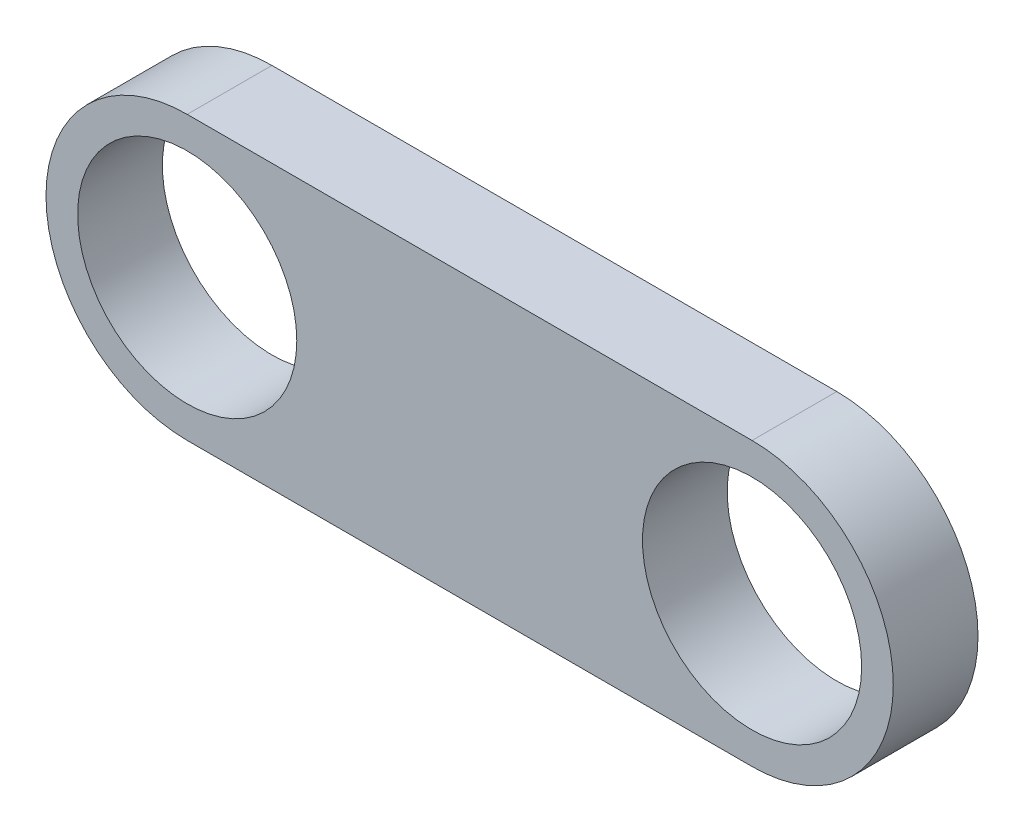
ISO-10303-21;
HEADER;
FILE_DESCRIPTION(('STEP AP214'),'2;1');
FILE_NAME('part.step','',(''),(''),'','','');
FILE_SCHEMA(('AUTOMOTIVE_DESIGN { 1 0 10303 214 1 1 1 1 }'));
ENDSEC;
DATA;
#1=APPLICATION_CONTEXT('core data for automotive mechanical design processes');
#2=APPLICATION_PROTOCOL_DEFINITION('international standard','automotive_design',2000,#1);
#3=PRODUCT_CONTEXT('',#1,'mechanical');
#4=PRODUCT('Part','Part','',(#3));
#5=PRODUCT_RELATED_PRODUCT_CATEGORY('part','',(#4));
#6=PRODUCT_DEFINITION_FORMATION('','',#4);
#7=PRODUCT_DEFINITION_CONTEXT('part definition',#1,'design');
#8=PRODUCT_DEFINITION('design','',#6,#7);
#9=PRODUCT_DEFINITION_SHAPE('','',#8);
#10=(LENGTH_UNIT() NAMED_UNIT(*) SI_UNIT(.MILLI.,.METRE.));
#11=(NAMED_UNIT(*) PLANE_ANGLE_UNIT() SI_UNIT($,.RADIAN.));
#12=(NAMED_UNIT(*) SI_UNIT($,.STERADIAN.) SOLID_ANGLE_UNIT());
#13=UNCERTAINTY_MEASURE_WITH_UNIT(LENGTH_MEASURE(1.E-05),#10,'distance_accuracy_value','');
#14=(GEOMETRIC_REPRESENTATION_CONTEXT(3) GLOBAL_UNCERTAINTY_ASSIGNED_CONTEXT((#13)) GLOBAL_UNIT_ASSIGNED_CONTEXT((#10,
#11,#12)) REPRESENTATION_CONTEXT('',''));
#15=CARTESIAN_POINT('',(0.,0.,0.));
#16=DIRECTION('',(0.,0.,1.));
#17=DIRECTION('',(1.,0.,0.));
#18=AXIS2_PLACEMENT_3D('',#15,#16,#17);
#19=CARTESIAN_POINT('',(-12.2019654064157,0.105370501409911,3.));
#20=DIRECTION('',(0.,0.,1.));
#21=DIRECTION('',(1.,0.,0.));
#22=AXIS2_PLACEMENT_3D('',#19,#20,#21);
#23=PLANE('',#22);
#24=CARTESIAN_POINT('',(-12.2019654064157,0.105370501409911,3.));
#25=DIRECTION('',(0.,0.,1.));
#26=DIRECTION('',(1.,0.,0.));
#27=AXIS2_PLACEMENT_3D('',#24,#25,#26);
#28=CIRCLE('',#27,3.88);
#29=CARTESIAN_POINT('',(-8.32196540641566,0.105370501409911,3.));
#30=VERTEX_POINT('',#29);
#31=EDGE_CURVE('E112',#30,#30,#28,.T.);
#32=ORIENTED_EDGE('',*,*,#31,.F.);
#33=EDGE_LOOP('',(#32));
#34=FACE_BOUND('',#33,.T.);
#35=CARTESIAN_POINT('',(-12.2019654064157,0.105370501409911,3.));
#36=DIRECTION('',(0.,0.,1.));
#37=DIRECTION('',(1.,0.,0.));
#38=AXIS2_PLACEMENT_3D('',#35,#36,#37);
#39=CIRCLE('',#38,5.00000000000001);
#40=CARTESIAN_POINT('',(-12.2019654064156,5.10537050140992,3.));
#41=VERTEX_POINT('',#40);
#42=CARTESIAN_POINT('',(-12.2019654064157,-4.8946294985901,3.));
#43=VERTEX_POINT('',#42);
#44=EDGE_CURVE('E92',#41,#43,#39,.T.);
#45=ORIENTED_EDGE('',*,*,#44,.T.);
#46=DIRECTION('',(1.,0.,0.));
#47=VECTOR('',#46,1.);
#48=CARTESIAN_POINT('',(-12.2019654064157,-4.8946294985901,3.));
#49=LINE('',#48,#47);
#50=CARTESIAN_POINT('',(7.79803459358435,-4.8946294985901,3.));
#51=VERTEX_POINT('',#50);
#52=EDGE_CURVE('E87',#43,#51,#49,.T.);
#53=ORIENTED_EDGE('',*,*,#52,.T.);
#54=CARTESIAN_POINT('',(7.79803459358435,0.105370501409911,3.));
#55=DIRECTION('',(0.,0.,1.));
#56=DIRECTION('',(-1.,0.,0.));
#57=AXIS2_PLACEMENT_3D('',#54,#55,#56);
#58=CIRCLE('',#57,5.00000000000001);
#59=CARTESIAN_POINT('',(7.79803459358435,5.10537050140992,3.));
#60=VERTEX_POINT('',#59);
#61=EDGE_CURVE('E90',#51,#60,#58,.T.);
#62=ORIENTED_EDGE('',*,*,#61,.T.);
#63=DIRECTION('',(-1.,0.,0.));
#64=VECTOR('',#63,1.);
#65=CARTESIAN_POINT('',(-12.2019654064156,5.10537050140992,3.));
#66=LINE('',#65,#64);
#67=EDGE_CURVE('E57',#60,#41,#66,.T.);
#68=ORIENTED_EDGE('',*,*,#67,.T.);
#69=EDGE_LOOP('',(#45,#53,#62,#68));
#70=FACE_BOUND('',#69,.T.);
#71=CARTESIAN_POINT('',(7.79803459358435,0.105370501409911,3.));
#72=DIRECTION('',(0.,0.,1.));
#73=DIRECTION('',(1.,0.,0.));
#74=AXIS2_PLACEMENT_3D('',#71,#72,#73);
#75=CIRCLE('',#74,3.88);
#76=CARTESIAN_POINT('',(11.6780345935843,0.105370501409911,3.));
#77=VERTEX_POINT('',#76);
#78=EDGE_CURVE('E134',#77,#77,#75,.T.);
#79=ORIENTED_EDGE('',*,*,#78,.F.);
#80=EDGE_LOOP('',(#79));
#81=FACE_BOUND('',#80,.T.);
#82=ADVANCED_FACE('F39',(#34,#70,#81),#23,.T.);
#83=CARTESIAN_POINT('',(-12.2019654064157,0.105370501409911,0.));
#84=DIRECTION('',(0.,0.,1.));
#85=DIRECTION('',(1.,0.,0.));
#86=AXIS2_PLACEMENT_3D('',#83,#84,#85);
#87=PLANE('',#86);
#88=CARTESIAN_POINT('',(-12.2019654064157,0.105370501409911,0.));
#89=DIRECTION('',(0.,0.,1.));
#90=DIRECTION('',(1.,0.,0.));
#91=AXIS2_PLACEMENT_3D('',#88,#89,#90);
#92=CIRCLE('',#91,5.00000000000001);
#93=CARTESIAN_POINT('',(-12.2019654064156,5.10537050140992,0.));
#94=VERTEX_POINT('',#93);
#95=CARTESIAN_POINT('',(-12.2019654064157,-4.8946294985901,0.));
#96=VERTEX_POINT('',#95);
#97=EDGE_CURVE('E108',#94,#96,#92,.T.);
#98=ORIENTED_EDGE('',*,*,#97,.F.);
#99=DIRECTION('',(-1.,0.,0.));
#100=VECTOR('',#99,1.);
#101=CARTESIAN_POINT('',(-12.2019654064156,5.10537050140992,0.));
#102=LINE('',#101,#100);
#103=CARTESIAN_POINT('',(7.79803459358435,5.10537050140992,0.));
#104=VERTEX_POINT('',#103);
#105=EDGE_CURVE('E80',#104,#94,#102,.T.);
#106=ORIENTED_EDGE('',*,*,#105,.F.);
#107=CARTESIAN_POINT('',(7.79803459358435,0.105370501409911,0.));
#108=DIRECTION('',(0.,0.,1.));
#109=DIRECTION('',(-1.,0.,0.));
#110=AXIS2_PLACEMENT_3D('',#107,#108,#109);
#111=CIRCLE('',#110,5.00000000000001);
#112=CARTESIAN_POINT('',(7.79803459358435,-4.8946294985901,0.));
#113=VERTEX_POINT('',#112);
#114=EDGE_CURVE('E74',#113,#104,#111,.T.);
#115=ORIENTED_EDGE('',*,*,#114,.F.);
#116=DIRECTION('',(1.,0.,0.));
#117=VECTOR('',#116,1.);
#118=CARTESIAN_POINT('',(-12.2019654064157,-4.8946294985901,0.));
#119=LINE('',#118,#117);
#120=EDGE_CURVE('E97',#96,#113,#119,.T.);
#121=ORIENTED_EDGE('',*,*,#120,.F.);
#122=EDGE_LOOP('',(#98,#106,#115,#121));
#123=FACE_BOUND('',#122,.T.);
#124=CARTESIAN_POINT('',(-12.2019654064157,0.105370501409911,0.));
#125=DIRECTION('',(0.,0.,1.));
#126=DIRECTION('',(1.,0.,0.));
#127=AXIS2_PLACEMENT_3D('',#124,#125,#126);
#128=CIRCLE('',#127,3.88);
#129=CARTESIAN_POINT('',(-8.32196540641566,0.105370501409911,0.));
#130=VERTEX_POINT('',#129);
#131=EDGE_CURVE('E130',#130,#130,#128,.T.);
#132=ORIENTED_EDGE('',*,*,#131,.T.);
#133=EDGE_LOOP('',(#132));
#134=FACE_BOUND('',#133,.T.);
#135=CARTESIAN_POINT('',(7.79803459358435,0.105370501409911,0.));
#136=DIRECTION('',(0.,0.,1.));
#137=DIRECTION('',(1.,0.,0.));
#138=AXIS2_PLACEMENT_3D('',#135,#136,#137);
#139=CIRCLE('',#138,3.88);
#140=CARTESIAN_POINT('',(11.6780345935843,0.105370501409911,0.));
#141=VERTEX_POINT('',#140);
#142=EDGE_CURVE('E138',#141,#141,#139,.T.);
#143=ORIENTED_EDGE('',*,*,#142,.T.);
#144=EDGE_LOOP('',(#143));
#145=FACE_BOUND('',#144,.T.);
#146=ADVANCED_FACE('F125',(#123,#134,#145),#87,.F.);
#147=CARTESIAN_POINT('',(-12.2019654064157,0.105370501409911,3.));
#148=DIRECTION('',(0.,0.,-1.));
#149=DIRECTION('',(-1.,0.,0.));
#150=AXIS2_PLACEMENT_3D('',#147,#148,#149);
#151=CYLINDRICAL_SURFACE('',#150,5.00000000000001);
#152=ORIENTED_EDGE('',*,*,#97,.T.);
#153=DIRECTION('',(0.,0.,-1.));
#154=VECTOR('',#153,1.);
#155=CARTESIAN_POINT('',(-12.2019654064157,-4.8946294985901,3.));
#156=LINE('',#155,#154);
#157=EDGE_CURVE('E11',#43,#96,#156,.T.);
#158=ORIENTED_EDGE('',*,*,#157,.F.);
#159=ORIENTED_EDGE('',*,*,#44,.F.);
#160=DIRECTION('',(0.,0.,-1.));
#161=VECTOR('',#160,1.);
#162=CARTESIAN_POINT('',(-12.2019654064156,5.10537050140992,3.));
#163=LINE('',#162,#161);
#164=EDGE_CURVE('E104',#41,#94,#163,.T.);
#165=ORIENTED_EDGE('',*,*,#164,.T.);
#166=EDGE_LOOP('',(#152,#158,#159,#165));
#167=FACE_BOUND('',#166,.T.);
#168=ADVANCED_FACE('F41',(#167),#151,.T.);
#169=CARTESIAN_POINT('',(-12.2019654064157,-4.8946294985901,3.));
#170=DIRECTION('',(0.,1.,0.));
#171=DIRECTION('',(0.,0.,1.));
#172=AXIS2_PLACEMENT_3D('',#169,#170,#171);
#173=PLANE('',#172);
#174=ORIENTED_EDGE('',*,*,#120,.T.);
#175=DIRECTION('',(0.,0.,-1.));
#176=VECTOR('',#175,1.);
#177=CARTESIAN_POINT('',(7.79803459358435,-4.8946294985901,3.));
#178=LINE('',#177,#176);
#179=EDGE_CURVE('E49',#51,#113,#178,.T.);
#180=ORIENTED_EDGE('',*,*,#179,.F.);
#181=ORIENTED_EDGE('',*,*,#52,.F.);
#182=ORIENTED_EDGE('',*,*,#157,.T.);
#183=EDGE_LOOP('',(#174,#180,#181,#182));
#184=FACE_BOUND('',#183,.T.);
#185=ADVANCED_FACE('F96',(#184),#173,.F.);
#186=CARTESIAN_POINT('',(7.79803459358435,0.105370501409911,3.));
#187=DIRECTION('',(0.,0.,-1.));
#188=DIRECTION('',(-1.,0.,0.));
#189=AXIS2_PLACEMENT_3D('',#186,#187,#188);
#190=CYLINDRICAL_SURFACE('',#189,5.00000000000001);
#191=ORIENTED_EDGE('',*,*,#114,.T.);
#192=DIRECTION('',(0.,0.,-1.));
#193=VECTOR('',#192,1.);
#194=CARTESIAN_POINT('',(7.79803459358435,5.10537050140992,3.));
#195=LINE('',#194,#193);
#196=EDGE_CURVE('E99',#60,#104,#195,.T.);
#197=ORIENTED_EDGE('',*,*,#196,.F.);
#198=ORIENTED_EDGE('',*,*,#61,.F.);
#199=ORIENTED_EDGE('',*,*,#179,.T.);
#200=EDGE_LOOP('',(#191,#197,#198,#199));
#201=FACE_BOUND('',#200,.T.);
#202=ADVANCED_FACE('F100',(#201),#190,.T.);
#203=CARTESIAN_POINT('',(-12.2019654064156,5.10537050140992,3.));
#204=DIRECTION('',(0.,-1.,0.));
#205=DIRECTION('',(0.,0.,-1.));
#206=AXIS2_PLACEMENT_3D('',#203,#204,#205);
#207=PLANE('',#206);
#208=ORIENTED_EDGE('',*,*,#105,.T.);
#209=ORIENTED_EDGE('',*,*,#164,.F.);
#210=ORIENTED_EDGE('',*,*,#67,.F.);
#211=ORIENTED_EDGE('',*,*,#196,.T.);
#212=EDGE_LOOP('',(#208,#209,#210,#211));
#213=FACE_BOUND('',#212,.T.);
#214=ADVANCED_FACE('F122',(#213),#207,.F.);
#215=CARTESIAN_POINT('',(-12.2019654064157,0.105370501409911,3.));
#216=DIRECTION('',(0.,0.,-1.));
#217=DIRECTION('',(-1.,0.,0.));
#218=AXIS2_PLACEMENT_3D('',#215,#216,#217);
#219=CYLINDRICAL_SURFACE('',#218,3.88);
#220=ORIENTED_EDGE('',*,*,#31,.T.);
#221=EDGE_LOOP('',(#220));
#222=FACE_BOUND('',#221,.T.);
#223=ORIENTED_EDGE('',*,*,#131,.F.);
#224=EDGE_LOOP('',(#223));
#225=FACE_BOUND('',#224,.T.);
#226=ADVANCED_FACE('F157',(#222,#225),#219,.F.);
#227=CARTESIAN_POINT('',(7.79803459358435,0.105370501409911,3.));
#228=DIRECTION('',(0.,0.,-1.));
#229=DIRECTION('',(-1.,0.,0.));
#230=AXIS2_PLACEMENT_3D('',#227,#228,#229);
#231=CYLINDRICAL_SURFACE('',#230,3.88);
#232=ORIENTED_EDGE('',*,*,#78,.T.);
#233=EDGE_LOOP('',(#232));
#234=FACE_BOUND('',#233,.T.);
#235=ORIENTED_EDGE('',*,*,#142,.F.);
#236=EDGE_LOOP('',(#235));
#237=FACE_BOUND('',#236,.T.);
#238=ADVANCED_FACE('F146',(#234,#237),#231,.F.);
#239=CLOSED_SHELL('',(#82,#146,#168,#185,#202,#214,#226,#238));
#240=MANIFOLD_SOLID_BREP('B2',#239);
#241=ADVANCED_BREP_SHAPE_REPRESENTATION('',(#18,#240),#14);
#242=SHAPE_DEFINITION_REPRESENTATION(#9,#241);
ENDSEC;
END-ISO-10303-21;
